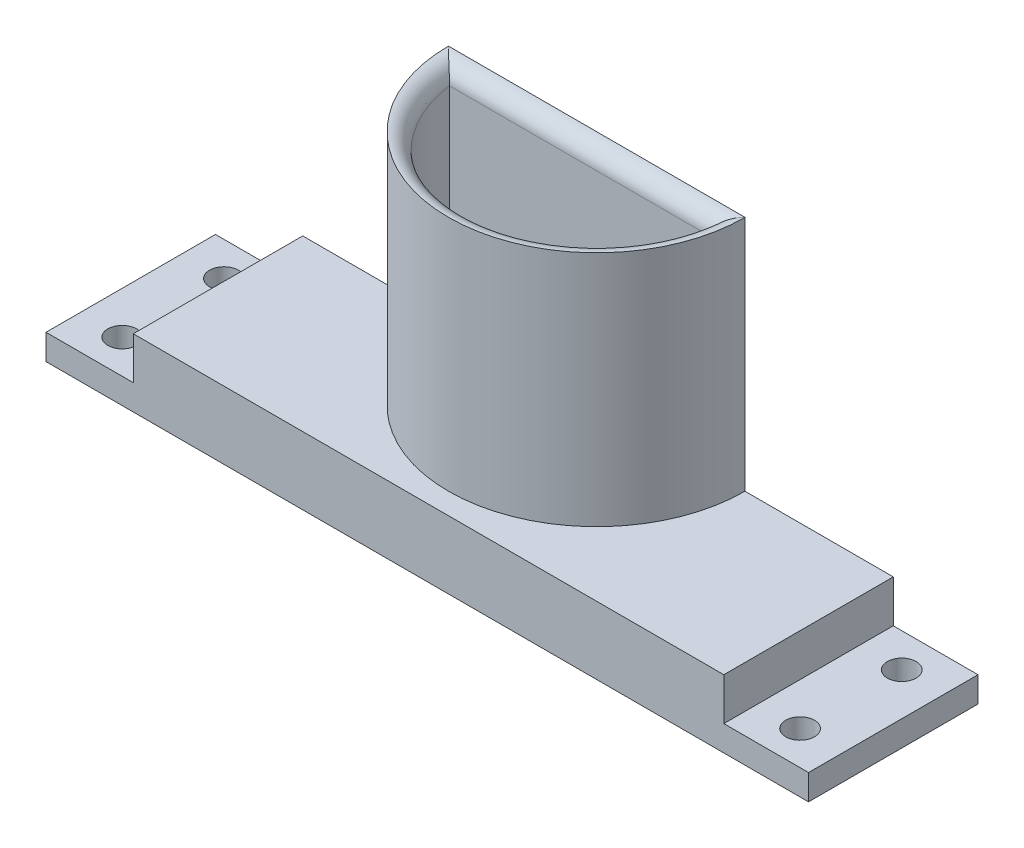
ISO-10303-21;
HEADER;
FILE_DESCRIPTION(('STEP AP214'),'2;1');
FILE_NAME('part.step','',(''),(''),'','','');
FILE_SCHEMA(('AUTOMOTIVE_DESIGN { 1 0 10303 214 1 1 1 1 }'));
ENDSEC;
DATA;
#1=APPLICATION_CONTEXT('core data for automotive mechanical design processes');
#2=APPLICATION_PROTOCOL_DEFINITION('international standard','automotive_design',2000,#1);
#3=PRODUCT_CONTEXT('',#1,'mechanical');
#4=PRODUCT('Part','Part','',(#3));
#5=PRODUCT_RELATED_PRODUCT_CATEGORY('part','',(#4));
#6=PRODUCT_DEFINITION_FORMATION('','',#4);
#7=PRODUCT_DEFINITION_CONTEXT('part definition',#1,'design');
#8=PRODUCT_DEFINITION('design','',#6,#7);
#9=PRODUCT_DEFINITION_SHAPE('','',#8);
#10=(LENGTH_UNIT() NAMED_UNIT(*) SI_UNIT(.MILLI.,.METRE.));
#11=(NAMED_UNIT(*) PLANE_ANGLE_UNIT() SI_UNIT($,.RADIAN.));
#12=(NAMED_UNIT(*) SI_UNIT($,.STERADIAN.) SOLID_ANGLE_UNIT());
#13=UNCERTAINTY_MEASURE_WITH_UNIT(LENGTH_MEASURE(1.E-05),#10,'distance_accuracy_value','');
#14=(GEOMETRIC_REPRESENTATION_CONTEXT(3) GLOBAL_UNCERTAINTY_ASSIGNED_CONTEXT((#13)) GLOBAL_UNIT_ASSIGNED_CONTEXT((#10,
#11,#12)) REPRESENTATION_CONTEXT('',''));
#15=CARTESIAN_POINT('',(0.,0.,0.));
#16=DIRECTION('',(0.,0.,1.));
#17=DIRECTION('',(1.,0.,0.));
#18=AXIS2_PLACEMENT_3D('',#15,#16,#17);
#19=CARTESIAN_POINT('',(0.,5.,0.));
#20=DIRECTION('',(0.,-1.,0.));
#21=DIRECTION('',(0.,0.,-1.));
#22=AXIS2_PLACEMENT_3D('',#19,#20,#21);
#23=PLANE('',#22);
#24=DIRECTION('',(0.,0.,-1.));
#25=VECTOR('',#24,1.);
#26=CARTESIAN_POINT('',(-34.7,5.,10.));
#27=LINE('',#26,#25);
#28=CARTESIAN_POINT('',(-34.7,5.,10.));
#29=VERTEX_POINT('',#28);
#30=CARTESIAN_POINT('',(-34.7,5.,-10.));
#31=VERTEX_POINT('',#30);
#32=EDGE_CURVE('E167',#29,#31,#27,.T.);
#33=ORIENTED_EDGE('',*,*,#32,.F.);
#34=DIRECTION('',(1.,0.,0.));
#35=VECTOR('',#34,1.);
#36=CARTESIAN_POINT('',(-35.,5.,10.));
#37=LINE('',#36,#35);
#38=CARTESIAN_POINT('',(35.,5.,10.));
#39=VERTEX_POINT('',#38);
#40=EDGE_CURVE('E245',#29,#39,#37,.T.);
#41=ORIENTED_EDGE('',*,*,#40,.T.);
#42=DIRECTION('',(0.,0.,-1.));
#43=VECTOR('',#42,1.);
#44=CARTESIAN_POINT('',(35.,5.,10.));
#45=LINE('',#44,#43);
#46=CARTESIAN_POINT('',(35.,5.,-10.));
#47=VERTEX_POINT('',#46);
#48=EDGE_CURVE('E239',#39,#47,#45,.T.);
#49=ORIENTED_EDGE('',*,*,#48,.T.);
#50=DIRECTION('',(-1.,0.,0.));
#51=VECTOR('',#50,1.);
#52=CARTESIAN_POINT('',(-35.,5.,-10.));
#53=LINE('',#52,#51);
#54=CARTESIAN_POINT('',(17.5,5.,-10.));
#55=VERTEX_POINT('',#54);
#56=EDGE_CURVE('E243',#47,#55,#53,.T.);
#57=ORIENTED_EDGE('',*,*,#56,.T.);
#58=CARTESIAN_POINT('',(0.,5.,-10.));
#59=DIRECTION('',(0.,1.,0.));
#60=DIRECTION('',(0.,0.,1.));
#61=AXIS2_PLACEMENT_3D('',#58,#59,#60);
#62=CIRCLE('',#61,17.5);
#63=CARTESIAN_POINT('',(-17.5,5.,-10.));
#64=VERTEX_POINT('',#63);
#65=EDGE_CURVE('E191',#64,#55,#62,.T.);
#66=ORIENTED_EDGE('',*,*,#65,.F.);
#67=EDGE_CURVE('E242',#64,#31,#53,.T.);
#68=ORIENTED_EDGE('',*,*,#67,.T.);
#69=EDGE_LOOP('',(#33,#41,#49,#57,#66,#68));
#70=FACE_BOUND('',#69,.T.);
#71=ADVANCED_FACE('F43',(#70),#23,.F.);
#72=CARTESIAN_POINT('',(35.,5.,10.));
#73=DIRECTION('',(-1.,0.,0.));
#74=DIRECTION('',(0.,0.,1.));
#75=AXIS2_PLACEMENT_3D('',#72,#73,#74);
#76=PLANE('',#75);
#77=DIRECTION('',(0.,0.,-1.));
#78=VECTOR('',#77,1.);
#79=CARTESIAN_POINT('',(35.,0.,10.));
#80=LINE('',#79,#78);
#81=CARTESIAN_POINT('',(35.,0.,10.));
#82=VERTEX_POINT('',#81);
#83=CARTESIAN_POINT('',(35.,0.,-10.));
#84=VERTEX_POINT('',#83);
#85=EDGE_CURVE('E238',#82,#84,#80,.T.);
#86=ORIENTED_EDGE('',*,*,#85,.T.);
#87=DIRECTION('',(0.,-1.,0.));
#88=VECTOR('',#87,1.);
#89=CARTESIAN_POINT('',(35.,5.,-10.));
#90=LINE('',#89,#88);
#91=EDGE_CURVE('E252',#47,#84,#90,.T.);
#92=ORIENTED_EDGE('',*,*,#91,.F.);
#93=ORIENTED_EDGE('',*,*,#48,.F.);
#94=DIRECTION('',(0.,-1.,0.));
#95=VECTOR('',#94,1.);
#96=CARTESIAN_POINT('',(35.,5.,10.));
#97=LINE('',#96,#95);
#98=EDGE_CURVE('E247',#39,#82,#97,.T.);
#99=ORIENTED_EDGE('',*,*,#98,.T.);
#100=EDGE_LOOP('',(#86,#92,#93,#99));
#101=FACE_BOUND('',#100,.T.);
#102=ADVANCED_FACE('F325',(#101),#76,.F.);
#103=CARTESIAN_POINT('',(-35.,5.,-10.));
#104=DIRECTION('',(0.,0.,1.));
#105=DIRECTION('',(1.,0.,0.));
#106=AXIS2_PLACEMENT_3D('',#103,#104,#105);
#107=PLANE('',#106);
#108=DIRECTION('',(1.,0.,0.));
#109=VECTOR('',#108,1.);
#110=CARTESIAN_POINT('',(-45.,0.,-10.));
#111=LINE('',#110,#109);
#112=CARTESIAN_POINT('',(-45.,0.,-10.));
#113=VERTEX_POINT('',#112);
#114=CARTESIAN_POINT('',(-34.7,0.,-10.));
#115=VERTEX_POINT('',#114);
#116=EDGE_CURVE('E142',#113,#115,#111,.T.);
#117=ORIENTED_EDGE('',*,*,#116,.T.);
#118=DIRECTION('',(0.,-1.,0.));
#119=VECTOR('',#118,1.);
#120=CARTESIAN_POINT('',(-34.7,5.,-10.));
#121=LINE('',#120,#119);
#122=EDGE_CURVE('E147',#31,#115,#121,.T.);
#123=ORIENTED_EDGE('',*,*,#122,.F.);
#124=ORIENTED_EDGE('',*,*,#67,.F.);
#125=DIRECTION('',(0.,-1.,0.));
#126=VECTOR('',#125,1.);
#127=CARTESIAN_POINT('',(-17.5,33.,-10.));
#128=LINE('',#127,#126);
#129=CARTESIAN_POINT('',(-17.5,33.,-10.));
#130=VERTEX_POINT('',#129);
#131=EDGE_CURVE('E206',#130,#64,#128,.T.);
#132=ORIENTED_EDGE('',*,*,#131,.F.);
#133=DIRECTION('',(-1.,0.,0.));
#134=VECTOR('',#133,1.);
#135=CARTESIAN_POINT('',(0.,33.,-10.));
#136=LINE('',#135,#134);
#137=CARTESIAN_POINT('',(17.5,33.,-10.));
#138=VERTEX_POINT('',#137);
#139=EDGE_CURVE('E195',#138,#130,#136,.T.);
#140=ORIENTED_EDGE('',*,*,#139,.F.);
#141=DIRECTION('',(0.,-1.,0.));
#142=VECTOR('',#141,1.);
#143=CARTESIAN_POINT('',(17.5,33.,-10.));
#144=LINE('',#143,#142);
#145=EDGE_CURVE('E201',#138,#55,#144,.T.);
#146=ORIENTED_EDGE('',*,*,#145,.T.);
#147=ORIENTED_EDGE('',*,*,#56,.F.);
#148=ORIENTED_EDGE('',*,*,#91,.T.);
#149=CARTESIAN_POINT('',(45.,0.,-10.));
#150=VERTEX_POINT('',#149);
#151=EDGE_CURVE('E155',#84,#150,#111,.T.);
#152=ORIENTED_EDGE('',*,*,#151,.T.);
#153=DIRECTION('',(0.,1.,0.));
#154=VECTOR('',#153,1.);
#155=CARTESIAN_POINT('',(45.,-3.,-10.));
#156=LINE('',#155,#154);
#157=CARTESIAN_POINT('',(45.,-3.,-10.));
#158=VERTEX_POINT('',#157);
#159=EDGE_CURVE('E220',#158,#150,#156,.T.);
#160=ORIENTED_EDGE('',*,*,#159,.F.);
#161=DIRECTION('',(1.,0.,0.));
#162=VECTOR('',#161,1.);
#163=CARTESIAN_POINT('',(-45.,-3.,-10.));
#164=LINE('',#163,#162);
#165=CARTESIAN_POINT('',(17.5,-3.,-10.));
#166=VERTEX_POINT('',#165);
#167=EDGE_CURVE('E216',#166,#158,#164,.T.);
#168=ORIENTED_EDGE('',*,*,#167,.F.);
#169=CARTESIAN_POINT('',(-17.5,-3.,-10.));
#170=VERTEX_POINT('',#169);
#171=EDGE_CURVE('E221',#170,#166,#164,.T.);
#172=ORIENTED_EDGE('',*,*,#171,.F.);
#173=CARTESIAN_POINT('',(-45.,-3.,-10.));
#174=VERTEX_POINT('',#173);
#175=EDGE_CURVE('E217',#174,#170,#164,.T.);
#176=ORIENTED_EDGE('',*,*,#175,.F.);
#177=DIRECTION('',(0.,1.,0.));
#178=VECTOR('',#177,1.);
#179=CARTESIAN_POINT('',(-45.,-3.,-10.));
#180=LINE('',#179,#178);
#181=EDGE_CURVE('E151',#174,#113,#180,.T.);
#182=ORIENTED_EDGE('',*,*,#181,.T.);
#183=EDGE_LOOP('',(#117,#123,#124,#132,#140,#146,#147,#148,#152,#160,#168,#172,#176,#182));
#184=FACE_BOUND('',#183,.T.);
#185=ADVANCED_FACE('F144',(#184),#107,.F.);
#186=CARTESIAN_POINT('',(-35.,5.,10.));
#187=DIRECTION('',(0.,0.,-1.));
#188=DIRECTION('',(-1.,0.,0.));
#189=AXIS2_PLACEMENT_3D('',#186,#187,#188);
#190=PLANE('',#189);
#191=DIRECTION('',(0.,1.,0.));
#192=VECTOR('',#191,1.);
#193=CARTESIAN_POINT('',(-34.7,0.,10.));
#194=LINE('',#193,#192);
#195=CARTESIAN_POINT('',(-34.7,0.,10.));
#196=VERTEX_POINT('',#195);
#197=EDGE_CURVE('E163',#196,#29,#194,.T.);
#198=ORIENTED_EDGE('',*,*,#197,.F.);
#199=DIRECTION('',(-1.,0.,0.));
#200=VECTOR('',#199,1.);
#201=CARTESIAN_POINT('',(-45.,0.,10.));
#202=LINE('',#201,#200);
#203=CARTESIAN_POINT('',(-45.,0.,10.));
#204=VERTEX_POINT('',#203);
#205=EDGE_CURVE('E160',#196,#204,#202,.T.);
#206=ORIENTED_EDGE('',*,*,#205,.T.);
#207=DIRECTION('',(0.,1.,0.));
#208=VECTOR('',#207,1.);
#209=CARTESIAN_POINT('',(-45.,-3.,10.));
#210=LINE('',#209,#208);
#211=CARTESIAN_POINT('',(-45.,-3.,10.));
#212=VERTEX_POINT('',#211);
#213=EDGE_CURVE('E232',#212,#204,#210,.T.);
#214=ORIENTED_EDGE('',*,*,#213,.F.);
#215=DIRECTION('',(-1.,0.,0.));
#216=VECTOR('',#215,1.);
#217=CARTESIAN_POINT('',(-45.,-3.,10.));
#218=LINE('',#217,#216);
#219=CARTESIAN_POINT('',(45.,-3.,10.));
#220=VERTEX_POINT('',#219);
#221=EDGE_CURVE('E212',#220,#212,#218,.T.);
#222=ORIENTED_EDGE('',*,*,#221,.F.);
#223=DIRECTION('',(0.,1.,0.));
#224=VECTOR('',#223,1.);
#225=CARTESIAN_POINT('',(45.,-3.,10.));
#226=LINE('',#225,#224);
#227=CARTESIAN_POINT('',(45.,0.,10.));
#228=VERTEX_POINT('',#227);
#229=EDGE_CURVE('E235',#220,#228,#226,.T.);
#230=ORIENTED_EDGE('',*,*,#229,.T.);
#231=EDGE_CURVE('E224',#228,#82,#202,.T.);
#232=ORIENTED_EDGE('',*,*,#231,.T.);
#233=ORIENTED_EDGE('',*,*,#98,.F.);
#234=ORIENTED_EDGE('',*,*,#40,.F.);
#235=EDGE_LOOP('',(#198,#206,#214,#222,#230,#232,#233,#234));
#236=FACE_BOUND('',#235,.T.);
#237=ADVANCED_FACE('F338',(#236),#190,.F.);
#238=CARTESIAN_POINT('',(0.,0.,0.));
#239=DIRECTION('',(0.,1.,0.));
#240=DIRECTION('',(0.,0.,1.));
#241=AXIS2_PLACEMENT_3D('',#238,#239,#240);
#242=PLANE('',#241);
#243=CARTESIAN_POINT('',(40.,0.,-6.));
#244=DIRECTION('',(0.,1.,0.));
#245=DIRECTION('',(0.,0.,1.));
#246=AXIS2_PLACEMENT_3D('',#243,#244,#245);
#247=CIRCLE('',#246,1.69999999999999);
#248=CARTESIAN_POINT('',(40.,0.,-4.3));
#249=VERTEX_POINT('',#248);
#250=EDGE_CURVE('E179',#249,#249,#247,.T.);
#251=ORIENTED_EDGE('',*,*,#250,.F.);
#252=EDGE_LOOP('',(#251));
#253=FACE_BOUND('',#252,.T.);
#254=CARTESIAN_POINT('',(40.,0.,6.));
#255=DIRECTION('',(0.,1.,0.));
#256=DIRECTION('',(0.,0.,1.));
#257=AXIS2_PLACEMENT_3D('',#254,#255,#256);
#258=CIRCLE('',#257,1.69999999999999);
#259=CARTESIAN_POINT('',(40.,0.,7.69999999999999));
#260=VERTEX_POINT('',#259);
#261=EDGE_CURVE('E185',#260,#260,#258,.T.);
#262=ORIENTED_EDGE('',*,*,#261,.F.);
#263=EDGE_LOOP('',(#262));
#264=FACE_BOUND('',#263,.T.);
#265=ORIENTED_EDGE('',*,*,#85,.F.);
#266=ORIENTED_EDGE('',*,*,#231,.F.);
#267=DIRECTION('',(0.,0.,1.));
#268=VECTOR('',#267,1.);
#269=CARTESIAN_POINT('',(45.,0.,-10.));
#270=LINE('',#269,#268);
#271=EDGE_CURVE('E209',#150,#228,#270,.T.);
#272=ORIENTED_EDGE('',*,*,#271,.F.);
#273=ORIENTED_EDGE('',*,*,#151,.F.);
#274=EDGE_LOOP('',(#265,#266,#272,#273));
#275=FACE_BOUND('',#274,.T.);
#276=ADVANCED_FACE('F341',(#253,#264,#275),#242,.T.);
#277=CARTESIAN_POINT('',(-40.,0.,-6.));
#278=DIRECTION('',(0.,1.,0.));
#279=DIRECTION('',(0.,0.,1.));
#280=AXIS2_PLACEMENT_3D('',#277,#278,#279);
#281=CIRCLE('',#280,1.69999999999999);
#282=CARTESIAN_POINT('',(-40.,0.,-4.30000000000001));
#283=VERTEX_POINT('',#282);
#284=EDGE_CURVE('E172',#283,#283,#281,.T.);
#285=ORIENTED_EDGE('',*,*,#284,.F.);
#286=EDGE_LOOP('',(#285));
#287=FACE_BOUND('',#286,.T.);
#288=CARTESIAN_POINT('',(-40.,0.,6.));
#289=DIRECTION('',(0.,1.,0.));
#290=DIRECTION('',(0.,0.,1.));
#291=AXIS2_PLACEMENT_3D('',#288,#289,#290);
#292=CIRCLE('',#291,1.69999999999999);
#293=CARTESIAN_POINT('',(-40.,0.,7.69999999999999));
#294=VERTEX_POINT('',#293);
#295=EDGE_CURVE('E175',#294,#294,#292,.T.);
#296=ORIENTED_EDGE('',*,*,#295,.F.);
#297=EDGE_LOOP('',(#296));
#298=FACE_BOUND('',#297,.T.);
#299=ORIENTED_EDGE('',*,*,#205,.F.);
#300=DIRECTION('',(0.,0.,1.));
#301=VECTOR('',#300,1.);
#302=CARTESIAN_POINT('',(-34.7,0.,-10.));
#303=LINE('',#302,#301);
#304=EDGE_CURVE('E158',#115,#196,#303,.T.);
#305=ORIENTED_EDGE('',*,*,#304,.F.);
#306=ORIENTED_EDGE('',*,*,#116,.F.);
#307=DIRECTION('',(0.,0.,-1.));
#308=VECTOR('',#307,1.);
#309=CARTESIAN_POINT('',(-45.,0.,-10.));
#310=LINE('',#309,#308);
#311=EDGE_CURVE('E227',#204,#113,#310,.T.);
#312=ORIENTED_EDGE('',*,*,#311,.F.);
#313=EDGE_LOOP('',(#299,#305,#306,#312));
#314=FACE_BOUND('',#313,.T.);
#315=ADVANCED_FACE('F159',(#287,#298,#314),#242,.T.);
#316=CARTESIAN_POINT('',(45.,-3.,-10.));
#317=DIRECTION('',(-1.,0.,0.));
#318=DIRECTION('',(0.,0.,1.));
#319=AXIS2_PLACEMENT_3D('',#316,#317,#318);
#320=PLANE('',#319);
#321=ORIENTED_EDGE('',*,*,#271,.T.);
#322=ORIENTED_EDGE('',*,*,#229,.F.);
#323=DIRECTION('',(0.,0.,1.));
#324=VECTOR('',#323,1.);
#325=CARTESIAN_POINT('',(45.,-3.,-10.));
#326=LINE('',#325,#324);
#327=EDGE_CURVE('E154',#158,#220,#326,.T.);
#328=ORIENTED_EDGE('',*,*,#327,.F.);
#329=ORIENTED_EDGE('',*,*,#159,.T.);
#330=EDGE_LOOP('',(#321,#322,#328,#329));
#331=FACE_BOUND('',#330,.T.);
#332=ADVANCED_FACE('F336',(#331),#320,.F.);
#333=CARTESIAN_POINT('',(-45.,-3.,-10.));
#334=DIRECTION('',(1.,0.,0.));
#335=DIRECTION('',(0.,0.,-1.));
#336=AXIS2_PLACEMENT_3D('',#333,#334,#335);
#337=PLANE('',#336);
#338=ORIENTED_EDGE('',*,*,#311,.T.);
#339=ORIENTED_EDGE('',*,*,#181,.F.);
#340=DIRECTION('',(0.,0.,-1.));
#341=VECTOR('',#340,1.);
#342=CARTESIAN_POINT('',(-45.,-3.,-10.));
#343=LINE('',#342,#341);
#344=EDGE_CURVE('E214',#212,#174,#343,.T.);
#345=ORIENTED_EDGE('',*,*,#344,.F.);
#346=ORIENTED_EDGE('',*,*,#213,.T.);
#347=EDGE_LOOP('',(#338,#339,#345,#346));
#348=FACE_BOUND('',#347,.T.);
#349=ADVANCED_FACE('F466',(#348),#337,.F.);
#350=CARTESIAN_POINT('',(0.,-3.,0.));
#351=DIRECTION('',(0.,1.,0.));
#352=DIRECTION('',(0.,0.,1.));
#353=AXIS2_PLACEMENT_3D('',#350,#351,#352);
#354=PLANE('',#353);
#355=CARTESIAN_POINT('',(-40.,-3.,-6.));
#356=DIRECTION('',(0.,1.,0.));
#357=DIRECTION('',(0.,0.,1.));
#358=AXIS2_PLACEMENT_3D('',#355,#356,#357);
#359=CIRCLE('',#358,1.69999999999999);
#360=CARTESIAN_POINT('',(-40.,-3.,-4.30000000000001));
#361=VERTEX_POINT('',#360);
#362=EDGE_CURVE('E48',#361,#361,#359,.T.);
#363=ORIENTED_EDGE('',*,*,#362,.T.);
#364=EDGE_LOOP('',(#363));
#365=FACE_BOUND('',#364,.T.);
#366=CARTESIAN_POINT('',(-40.,-3.,6.));
#367=DIRECTION('',(0.,1.,0.));
#368=DIRECTION('',(0.,0.,1.));
#369=AXIS2_PLACEMENT_3D('',#366,#367,#368);
#370=CIRCLE('',#369,1.69999999999999);
#371=CARTESIAN_POINT('',(-40.,-3.,7.69999999999999));
#372=VERTEX_POINT('',#371);
#373=EDGE_CURVE('E178',#372,#372,#370,.T.);
#374=ORIENTED_EDGE('',*,*,#373,.T.);
#375=EDGE_LOOP('',(#374));
#376=FACE_BOUND('',#375,.T.);
#377=CARTESIAN_POINT('',(40.,-3.,-6.));
#378=DIRECTION('',(0.,1.,0.));
#379=DIRECTION('',(0.,0.,1.));
#380=AXIS2_PLACEMENT_3D('',#377,#378,#379);
#381=CIRCLE('',#380,1.69999999999999);
#382=CARTESIAN_POINT('',(40.,-3.,-4.30000000000001));
#383=VERTEX_POINT('',#382);
#384=EDGE_CURVE('E182',#383,#383,#381,.T.);
#385=ORIENTED_EDGE('',*,*,#384,.T.);
#386=EDGE_LOOP('',(#385));
#387=FACE_BOUND('',#386,.T.);
#388=CARTESIAN_POINT('',(40.,-3.,6.));
#389=DIRECTION('',(0.,1.,0.));
#390=DIRECTION('',(0.,0.,1.));
#391=AXIS2_PLACEMENT_3D('',#388,#389,#390);
#392=CIRCLE('',#391,1.69999999999999);
#393=CARTESIAN_POINT('',(40.,-3.,7.69999999999999));
#394=VERTEX_POINT('',#393);
#395=EDGE_CURVE('E188',#394,#394,#392,.T.);
#396=ORIENTED_EDGE('',*,*,#395,.T.);
#397=EDGE_LOOP('',(#396));
#398=FACE_BOUND('',#397,.T.);
#399=ORIENTED_EDGE('',*,*,#175,.T.);
#400=CARTESIAN_POINT('',(0.,-3.,-10.));
#401=DIRECTION('',(0.,1.,0.));
#402=DIRECTION('',(0.,0.,1.));
#403=AXIS2_PLACEMENT_3D('',#400,#401,#402);
#404=CIRCLE('',#403,17.5);
#405=EDGE_CURVE('E261',#170,#166,#404,.T.);
#406=ORIENTED_EDGE('',*,*,#405,.T.);
#407=ORIENTED_EDGE('',*,*,#167,.T.);
#408=ORIENTED_EDGE('',*,*,#327,.T.);
#409=ORIENTED_EDGE('',*,*,#221,.T.);
#410=ORIENTED_EDGE('',*,*,#344,.T.);
#411=EDGE_LOOP('',(#399,#406,#407,#408,#409,#410));
#412=FACE_BOUND('',#411,.T.);
#413=ADVANCED_FACE('F306',(#365,#376,#387,#398,#412),#354,.F.);
#414=CARTESIAN_POINT('',(0.,33.,-10.));
#415=DIRECTION('',(0.,-1.,0.));
#416=DIRECTION('',(0.,0.,-1.));
#417=AXIS2_PLACEMENT_3D('',#414,#415,#416);
#418=CYLINDRICAL_SURFACE('',#417,17.5);
#419=ORIENTED_EDGE('',*,*,#65,.T.);
#420=ORIENTED_EDGE('',*,*,#145,.F.);
#421=CARTESIAN_POINT('',(0.,33.,-10.));
#422=DIRECTION('',(0.,1.,0.));
#423=DIRECTION('',(0.,0.,1.));
#424=AXIS2_PLACEMENT_3D('',#421,#422,#423);
#425=CIRCLE('',#424,17.5);
#426=EDGE_CURVE('E198',#130,#138,#425,.T.);
#427=ORIENTED_EDGE('',*,*,#426,.F.);
#428=ORIENTED_EDGE('',*,*,#131,.T.);
#429=EDGE_LOOP('',(#419,#420,#427,#428));
#430=FACE_BOUND('',#429,.T.);
#431=ADVANCED_FACE('F449',(#430),#418,.T.);
#432=CARTESIAN_POINT('',(0.,-3.,-10.));
#433=DIRECTION('',(0.,1.,0.));
#434=DIRECTION('',(0.,0.,1.));
#435=AXIS2_PLACEMENT_3D('',#432,#433,#434);
#436=CYLINDRICAL_SURFACE('',#435,15.5);
#437=DIRECTION('',(0.,1.,0.));
#438=VECTOR('',#437,1.);
#439=CARTESIAN_POINT('',(15.3704261489394,-3.,-8.));
#440=LINE('',#439,#438);
#441=CARTESIAN_POINT('',(15.3704261489394,-1.,-8.));
#442=VERTEX_POINT('',#441);
#443=CARTESIAN_POINT('',(15.3704261489394,31.,-8.));
#444=VERTEX_POINT('',#443);
#445=EDGE_CURVE('E192',#442,#444,#440,.T.);
#446=ORIENTED_EDGE('',*,*,#445,.F.);
#447=CARTESIAN_POINT('',(0.,-1.,-10.));
#448=DIRECTION('',(0.,1.,0.));
#449=DIRECTION('',(0.,0.,1.));
#450=AXIS2_PLACEMENT_3D('',#447,#448,#449);
#451=CIRCLE('',#450,15.5);
#452=CARTESIAN_POINT('',(-15.3704261489394,-1.,-8.));
#453=VERTEX_POINT('',#452);
#454=EDGE_CURVE('E11',#442,#453,#451,.F.);
#455=ORIENTED_EDGE('',*,*,#454,.T.);
#456=DIRECTION('',(0.,1.,0.));
#457=VECTOR('',#456,1.);
#458=CARTESIAN_POINT('',(-15.3704261489394,-3.,-8.));
#459=LINE('',#458,#457);
#460=CARTESIAN_POINT('',(-15.3704261489394,31.,-8.));
#461=VERTEX_POINT('',#460);
#462=EDGE_CURVE('E189',#453,#461,#459,.T.);
#463=ORIENTED_EDGE('',*,*,#462,.T.);
#464=CARTESIAN_POINT('',(0.,31.,-10.));
#465=DIRECTION('',(0.,1.,0.));
#466=DIRECTION('',(0.,0.,1.));
#467=AXIS2_PLACEMENT_3D('',#464,#465,#466);
#468=CIRCLE('',#467,15.5);
#469=EDGE_CURVE('E255',#461,#444,#468,.T.);
#470=ORIENTED_EDGE('',*,*,#469,.T.);
#471=EDGE_LOOP('',(#446,#455,#463,#470));
#472=FACE_BOUND('',#471,.T.);
#473=ADVANCED_FACE('F440',(#472),#436,.F.);
#474=CARTESIAN_POINT('',(15.3704261489394,-3.,-8.));
#475=DIRECTION('',(0.,0.,-1.));
#476=DIRECTION('',(-1.,0.,0.));
#477=AXIS2_PLACEMENT_3D('',#474,#475,#476);
#478=PLANE('',#477);
#479=ORIENTED_EDGE('',*,*,#462,.F.);
#480=DIRECTION('',(-1.,0.,0.));
#481=VECTOR('',#480,1.);
#482=CARTESIAN_POINT('',(15.3704261489394,-1.,-8.));
#483=LINE('',#482,#481);
#484=EDGE_CURVE('E53',#453,#442,#483,.F.);
#485=ORIENTED_EDGE('',*,*,#484,.T.);
#486=ORIENTED_EDGE('',*,*,#445,.T.);
#487=DIRECTION('',(-1.,0.,0.));
#488=VECTOR('',#487,1.);
#489=CARTESIAN_POINT('',(-15.3704261489394,31.,-8.));
#490=LINE('',#489,#488);
#491=EDGE_CURVE('E258',#444,#461,#490,.T.);
#492=ORIENTED_EDGE('',*,*,#491,.T.);
#493=EDGE_LOOP('',(#479,#485,#486,#492));
#494=FACE_BOUND('',#493,.T.);
#495=ADVANCED_FACE('F282',(#494),#478,.F.);
#496=CARTESIAN_POINT('',(15.3704261489394,31.,-10.));
#497=DIRECTION('',(1.,0.,0.));
#498=DIRECTION('',(0.,0.,-1.));
#499=AXIS2_PLACEMENT_3D('',#496,#497,#498);
#500=CYLINDRICAL_SURFACE('',#499,2.);
#501=CARTESIAN_POINT('',(15.3704261489394,31.,-8.));
#502=CARTESIAN_POINT('',(15.3704113490324,31.0434603124713,-7.99998789623637));
#503=CARTESIAN_POINT('',(15.3720384867977,31.0869097163397,-8.00141614860178));
#504=CARTESIAN_POINT('',(15.3784623074006,31.1733474667974,-8.00705955264037));
#505=CARTESIAN_POINT('',(15.3832557060606,31.2163362442655,-8.01127181662339));
#506=CARTESIAN_POINT('',(15.3958332317555,31.3010678103459,-8.0223326945883));
#507=CARTESIAN_POINT('',(15.4035861385886,31.3428188610949,-8.02915378911016));
#508=CARTESIAN_POINT('',(15.4218873065089,31.4252097834838,-8.04527211246546));
#509=CARTESIAN_POINT('',(15.4324361262038,31.4658494312796,-8.05456983611728));
#510=CARTESIAN_POINT('',(15.4678452451839,31.5853710437738,-8.08581947718849));
#511=CARTESIAN_POINT('',(15.496533325425,31.6622711603222,-8.11118487201765));
#512=CARTESIAN_POINT('',(15.5621676042231,31.8095168129804,-8.16942803416061));
#513=CARTESIAN_POINT('',(15.5991370150493,31.8798431219544,-8.20232692346899));
#514=CARTESIAN_POINT('',(15.6990783145784,32.0460657957153,-8.29164333111114));
#515=CARTESIAN_POINT('',(15.7659303858716,32.137671288152,-8.35169901986379));
#516=CARTESIAN_POINT('',(15.9090438640022,32.3055985847829,-8.48121517508006));
#517=CARTESIAN_POINT('',(15.9853250889464,32.3818872824975,-8.55069548098992));
#518=CARTESIAN_POINT('',(16.1218211511116,32.5007425086086,-8.67599534594904));
#519=CARTESIAN_POINT('',(16.1805623666144,32.5467729873894,-8.7302004625344));
#520=CARTESIAN_POINT('',(16.3004423371165,32.6317687906735,-8.84145191677523));
#521=CARTESIAN_POINT('',(16.3615821779766,32.6707308693488,-8.89849954447002));
#522=CARTESIAN_POINT('',(16.5476428293294,32.7775070718227,-9.07311939366307));
#523=CARTESIAN_POINT('',(16.6752124326251,32.8352175913138,-9.19417559964872));
#524=CARTESIAN_POINT('',(16.9181145433245,32.9198098930191,-9.42741593743311));
#525=CARTESIAN_POINT('',(17.0331179892186,32.9495227784052,-9.53896495980482));
#526=CARTESIAN_POINT('',(17.2635313505971,32.9894097494525,-9.76475155047689));
#527=CARTESIAN_POINT('',(17.3789397753517,32.9996275202113,-9.87898252567176));
#528=CARTESIAN_POINT('',(17.495783478261,32.9999966634796,-9.99578385666528));
#529=CARTESIAN_POINT('',(17.4978918559567,32.9999999965333,-9.99789185333453));
#530=CARTESIAN_POINT('',(17.5,33.,-10.));
#531=B_SPLINE_CURVE_WITH_KNOTS('',3,(#501,#502,#503,#504,#505,#506,#507,#508,#509,#510,#511,
#512,#513,#514,#515,#516,#517,#518,#519,#520,#521,#522,#523,#524,#525,#526,#527,#528,#529,#530),
.UNSPECIFIED.,.F.,.F.,(4,2,2,2,2,2,2,2,2,2,2,2,2,2,4),(0.,0.130309398659017,0.260483846779937,
0.389321409732268,0.518184733132639,0.774655769336656,1.03185488546772,1.41469409605983,
1.7983520909447,2.07470453961497,2.35118357061114,2.90410540558524,3.39188285813809,
3.87856599820887,3.88751027574357),.UNSPECIFIED.);
#532=EDGE_CURVE('E262',#138,#444,#531,.F.);
#533=ORIENTED_EDGE('',*,*,#532,.F.);
#534=ORIENTED_EDGE('',*,*,#139,.T.);
#535=CARTESIAN_POINT('',(-15.3704261489394,31.,-8.));
#536=CARTESIAN_POINT('',(-15.3704113490324,31.0434603124713,-7.99998789623637));
#537=CARTESIAN_POINT('',(-15.3720384867977,31.0869097163397,-8.00141614860178));
#538=CARTESIAN_POINT('',(-15.3784623074006,31.1733474667974,-8.00705955264037));
#539=CARTESIAN_POINT('',(-15.3832557060606,31.2163362442655,-8.01127181662339));
#540=CARTESIAN_POINT('',(-15.3958332317555,31.3010678103459,-8.0223326945883));
#541=CARTESIAN_POINT('',(-15.4035861385886,31.3428188610949,-8.02915378911016));
#542=CARTESIAN_POINT('',(-15.4218873065089,31.4252097834838,-8.04527211246546));
#543=CARTESIAN_POINT('',(-15.4324361262038,31.4658494312796,-8.05456983611728));
#544=CARTESIAN_POINT('',(-15.4678452451839,31.5853710437738,-8.08581947718849));
#545=CARTESIAN_POINT('',(-15.496533325425,31.6622711603222,-8.11118487201765));
#546=CARTESIAN_POINT('',(-15.5621676042231,31.8095168129804,-8.16942803416061));
#547=CARTESIAN_POINT('',(-15.5991370150493,31.8798431219544,-8.20232692346899));
#548=CARTESIAN_POINT('',(-15.6990783145784,32.0460657957153,-8.29164333111114));
#549=CARTESIAN_POINT('',(-15.7659303858716,32.137671288152,-8.35169901986379));
#550=CARTESIAN_POINT('',(-15.9090438640022,32.3055985847829,-8.48121517508006));
#551=CARTESIAN_POINT('',(-15.9853250889464,32.3818872824975,-8.55069548098992));
#552=CARTESIAN_POINT('',(-16.1218211511116,32.5007425086086,-8.67599534594904));
#553=CARTESIAN_POINT('',(-16.1805623666144,32.5467729873894,-8.7302004625344));
#554=CARTESIAN_POINT('',(-16.3004423371165,32.6317687906735,-8.84145191677523));
#555=CARTESIAN_POINT('',(-16.3615821779766,32.6707308693488,-8.89849954447002));
#556=CARTESIAN_POINT('',(-16.5476428293294,32.7775070718227,-9.07311939366307));
#557=CARTESIAN_POINT('',(-16.6752124326251,32.8352175913138,-9.19417559964872));
#558=CARTESIAN_POINT('',(-16.9181145433245,32.9198098930191,-9.42741593743311));
#559=CARTESIAN_POINT('',(-17.0331179892186,32.9495227784052,-9.53896495980482));
#560=CARTESIAN_POINT('',(-17.2635313505971,32.9894097494525,-9.76475155047689));
#561=CARTESIAN_POINT('',(-17.3789397753517,32.9996275202113,-9.87898252567176));
#562=CARTESIAN_POINT('',(-17.495783478261,32.9999966634796,-9.99578385666528));
#563=CARTESIAN_POINT('',(-17.4978918559567,32.9999999965333,-9.99789185333453));
#564=CARTESIAN_POINT('',(-17.5,33.,-10.));
#565=B_SPLINE_CURVE_WITH_KNOTS('',3,(#535,#536,#537,#538,#539,#540,#541,#542,#543,#544,#545,
#546,#547,#548,#549,#550,#551,#552,#553,#554,#555,#556,#557,#558,#559,#560,#561,#562,#563,#564),
.UNSPECIFIED.,.F.,.F.,(4,2,2,2,2,2,2,2,2,2,2,2,2,2,4),(0.,0.130309398659017,0.260483846779937,
0.389321409732268,0.518184733132639,0.774655769336656,1.03185488546772,1.41469409605983,
1.7983520909447,2.07470453961497,2.35118357061114,2.90410540558524,3.39188285813809,
3.87856599820887,3.88751027574357),.UNSPECIFIED.);
#566=EDGE_CURVE('E194',#461,#130,#565,.T.);
#567=ORIENTED_EDGE('',*,*,#566,.F.);
#568=ORIENTED_EDGE('',*,*,#491,.F.);
#569=EDGE_LOOP('',(#533,#534,#567,#568));
#570=FACE_BOUND('',#569,.T.);
#571=ADVANCED_FACE('F279',(#570),#500,.T.);
#572=CARTESIAN_POINT('',(0.,31.,-10.));
#573=DIRECTION('',(0.,1.,0.));
#574=DIRECTION('',(0.,0.,1.));
#575=AXIS2_PLACEMENT_3D('',#572,#573,#574);
#576=TOROIDAL_SURFACE('',#575,17.5,2.);
#577=ORIENTED_EDGE('',*,*,#566,.T.);
#578=ORIENTED_EDGE('',*,*,#426,.T.);
#579=ORIENTED_EDGE('',*,*,#532,.T.);
#580=ORIENTED_EDGE('',*,*,#469,.F.);
#581=EDGE_LOOP('',(#577,#578,#579,#580));
#582=FACE_BOUND('',#581,.T.);
#583=ADVANCED_FACE('F276',(#582),#576,.T.);
#584=CARTESIAN_POINT('',(0.,-1.,-10.));
#585=DIRECTION('',(0.,1.,0.));
#586=DIRECTION('',(0.,0.,1.));
#587=AXIS2_PLACEMENT_3D('',#584,#585,#586);
#588=TOROIDAL_SURFACE('',#587,17.5,2.);
#589=CARTESIAN_POINT('',(-15.3704261489394,-1.,-8.));
#590=CARTESIAN_POINT('',(-15.3704113490324,-1.04346031247127,-7.99998789623637));
#591=CARTESIAN_POINT('',(-15.3720384867977,-1.0869097163397,-8.00141614860178));
#592=CARTESIAN_POINT('',(-15.3784623074006,-1.17334746679736,-8.00705955264037));
#593=CARTESIAN_POINT('',(-15.3832557060606,-1.21633624426547,-8.01127181662339));
#594=CARTESIAN_POINT('',(-15.3958332317555,-1.30106781034593,-8.0223326945883));
#595=CARTESIAN_POINT('',(-15.4035861385886,-1.34281886109492,-8.02915378911016));
#596=CARTESIAN_POINT('',(-15.4218873065089,-1.42520978348377,-8.04527211246546));
#597=CARTESIAN_POINT('',(-15.4324361262038,-1.46584943127963,-8.05456983611728));
#598=CARTESIAN_POINT('',(-15.4678452451839,-1.58537104377379,-8.08581947718849));
#599=CARTESIAN_POINT('',(-15.496533325425,-1.66227116032219,-8.11118487201765));
#600=CARTESIAN_POINT('',(-15.5621676042231,-1.80951681298037,-8.16942803416061));
#601=CARTESIAN_POINT('',(-15.5991370150493,-1.87984312195444,-8.20232692346899));
#602=CARTESIAN_POINT('',(-15.6990783145784,-2.04606579571527,-8.29164333111114));
#603=CARTESIAN_POINT('',(-15.7659303858716,-2.13767128815196,-8.35169901986379));
#604=CARTESIAN_POINT('',(-15.9090438640022,-2.30559858478294,-8.48121517508007));
#605=CARTESIAN_POINT('',(-15.9853250889464,-2.38188728249755,-8.55069548098992));
#606=CARTESIAN_POINT('',(-16.1218211511116,-2.50074250860862,-8.67599534594904));
#607=CARTESIAN_POINT('',(-16.1805623666144,-2.54677298738937,-8.73020046253439));
#608=CARTESIAN_POINT('',(-16.3004423371165,-2.63176879067351,-8.84145191677522));
#609=CARTESIAN_POINT('',(-16.3615821779766,-2.67073086934884,-8.89849954447002));
#610=CARTESIAN_POINT('',(-16.5476428293294,-2.77750707182268,-9.07311939366307));
#611=CARTESIAN_POINT('',(-16.6752124326252,-2.83521759131378,-9.19417559964869));
#612=CARTESIAN_POINT('',(-16.9181145433245,-2.9198098930191,-9.42741593743313));
#613=CARTESIAN_POINT('',(-17.0331179892185,-2.94952277840521,-9.5389649598049));
#614=CARTESIAN_POINT('',(-17.2635313505972,-2.98940974945247,-9.76475155047682));
#615=CARTESIAN_POINT('',(-17.378939775352,-2.99962752021137,-9.87898252567148));
#616=CARTESIAN_POINT('',(-17.495783478261,-2.99999666347959,-9.99578385666527));
#617=CARTESIAN_POINT('',(-17.4978918559567,-2.99999999653327,-9.99789185333453));
#618=CARTESIAN_POINT('',(-17.5,-3.,-10.));
#619=B_SPLINE_CURVE_WITH_KNOTS('',3,(#589,#590,#591,#592,#593,#594,#595,#596,#597,#598,#599,
#600,#601,#602,#603,#604,#605,#606,#607,#608,#609,#610,#611,#612,#613,#614,#615,#616,#617,#618),
.UNSPECIFIED.,.F.,.F.,(4,2,2,2,2,2,2,2,2,2,2,2,2,2,4),(0.,0.130309398659014,0.260483846779928,
0.389321409732269,0.518184733132643,0.77465576933666,1.03185488546773,1.41469409605983,
1.7983520909447,2.07470453961497,2.35118357061113,2.90410540558525,3.39188285813811,
3.87856599820888,3.88751027574357),.UNSPECIFIED.);
#620=EDGE_CURVE('E291',#453,#170,#619,.T.);
#621=ORIENTED_EDGE('',*,*,#620,.F.);
#622=ORIENTED_EDGE('',*,*,#454,.F.);
#623=CARTESIAN_POINT('',(15.3704261489394,-1.,-8.));
#624=CARTESIAN_POINT('',(15.3704113490324,-1.04346031247127,-7.99998789623637));
#625=CARTESIAN_POINT('',(15.3720384867977,-1.0869097163397,-8.00141614860178));
#626=CARTESIAN_POINT('',(15.3784623074006,-1.17334746679736,-8.00705955264037));
#627=CARTESIAN_POINT('',(15.3832557060606,-1.21633624426547,-8.01127181662339));
#628=CARTESIAN_POINT('',(15.3958332317555,-1.30106781034593,-8.0223326945883));
#629=CARTESIAN_POINT('',(15.4035861385886,-1.34281886109492,-8.02915378911016));
#630=CARTESIAN_POINT('',(15.4218873065089,-1.42520978348377,-8.04527211246546));
#631=CARTESIAN_POINT('',(15.4324361262038,-1.46584943127963,-8.05456983611728));
#632=CARTESIAN_POINT('',(15.4678452451839,-1.58537104377379,-8.08581947718849));
#633=CARTESIAN_POINT('',(15.496533325425,-1.66227116032219,-8.11118487201765));
#634=CARTESIAN_POINT('',(15.5621676042231,-1.80951681298037,-8.16942803416061));
#635=CARTESIAN_POINT('',(15.5991370150493,-1.87984312195444,-8.20232692346899));
#636=CARTESIAN_POINT('',(15.6990783145784,-2.04606579571527,-8.29164333111114));
#637=CARTESIAN_POINT('',(15.7659303858716,-2.13767128815196,-8.35169901986379));
#638=CARTESIAN_POINT('',(15.9090438640022,-2.30559858478294,-8.48121517508007));
#639=CARTESIAN_POINT('',(15.9853250889464,-2.38188728249755,-8.55069548098992));
#640=CARTESIAN_POINT('',(16.1218211511116,-2.50074250860862,-8.67599534594904));
#641=CARTESIAN_POINT('',(16.1805623666144,-2.54677298738937,-8.73020046253439));
#642=CARTESIAN_POINT('',(16.3004423371165,-2.63176879067351,-8.84145191677522));
#643=CARTESIAN_POINT('',(16.3615821779766,-2.67073086934884,-8.89849954447002));
#644=CARTESIAN_POINT('',(16.5476428293294,-2.77750707182268,-9.07311939366307));
#645=CARTESIAN_POINT('',(16.6752124326252,-2.83521759131378,-9.19417559964869));
#646=CARTESIAN_POINT('',(16.9181145433245,-2.9198098930191,-9.42741593743313));
#647=CARTESIAN_POINT('',(17.0331179892185,-2.94952277840521,-9.5389649598049));
#648=CARTESIAN_POINT('',(17.2635313505972,-2.98940974945247,-9.76475155047682));
#649=CARTESIAN_POINT('',(17.378939775352,-2.99962752021137,-9.87898252567148));
#650=CARTESIAN_POINT('',(17.495783478261,-2.99999666347959,-9.99578385666527));
#651=CARTESIAN_POINT('',(17.4978918559567,-2.99999999653327,-9.99789185333453));
#652=CARTESIAN_POINT('',(17.5,-3.,-10.));
#653=B_SPLINE_CURVE_WITH_KNOTS('',3,(#623,#624,#625,#626,#627,#628,#629,#630,#631,#632,#633,
#634,#635,#636,#637,#638,#639,#640,#641,#642,#643,#644,#645,#646,#647,#648,#649,#650,#651,#652),
.UNSPECIFIED.,.F.,.F.,(4,2,2,2,2,2,2,2,2,2,2,2,2,2,4),(0.,0.130309398659014,0.260483846779928,
0.389321409732269,0.518184733132643,0.77465576933666,1.03185488546773,1.41469409605983,
1.7983520909447,2.07470453961497,2.35118357061113,2.90410540558525,3.39188285813811,
3.87856599820888,3.88751027574357),.UNSPECIFIED.);
#654=EDGE_CURVE('E67',#166,#442,#653,.F.);
#655=ORIENTED_EDGE('',*,*,#654,.F.);
#656=ORIENTED_EDGE('',*,*,#405,.F.);
#657=EDGE_LOOP('',(#621,#622,#655,#656));
#658=FACE_BOUND('',#657,.T.);
#659=ADVANCED_FACE('F284',(#658),#588,.T.);
#660=CARTESIAN_POINT('',(0.,-1.,-10.));
#661=DIRECTION('',(-1.,0.,0.));
#662=DIRECTION('',(0.,0.,1.));
#663=AXIS2_PLACEMENT_3D('',#660,#661,#662);
#664=CYLINDRICAL_SURFACE('',#663,2.);
#665=ORIENTED_EDGE('',*,*,#654,.T.);
#666=ORIENTED_EDGE('',*,*,#484,.F.);
#667=ORIENTED_EDGE('',*,*,#620,.T.);
#668=ORIENTED_EDGE('',*,*,#171,.T.);
#669=EDGE_LOOP('',(#665,#666,#667,#668));
#670=FACE_BOUND('',#669,.T.);
#671=ADVANCED_FACE('F45',(#670),#664,.T.);
#672=CARTESIAN_POINT('',(40.,0.,6.));
#673=DIRECTION('',(0.,1.,0.));
#674=DIRECTION('',(0.,0.,1.));
#675=AXIS2_PLACEMENT_3D('',#672,#673,#674);
#676=CYLINDRICAL_SURFACE('',#675,1.69999999999999);
#677=ORIENTED_EDGE('',*,*,#261,.T.);
#678=EDGE_LOOP('',(#677));
#679=FACE_BOUND('',#678,.T.);
#680=ORIENTED_EDGE('',*,*,#395,.F.);
#681=EDGE_LOOP('',(#680));
#682=FACE_BOUND('',#681,.T.);
#683=ADVANCED_FACE('F321',(#679,#682),#676,.F.);
#684=CARTESIAN_POINT('',(40.,0.,-6.));
#685=DIRECTION('',(0.,1.,0.));
#686=DIRECTION('',(0.,0.,1.));
#687=AXIS2_PLACEMENT_3D('',#684,#685,#686);
#688=CYLINDRICAL_SURFACE('',#687,1.69999999999999);
#689=ORIENTED_EDGE('',*,*,#250,.T.);
#690=EDGE_LOOP('',(#689));
#691=FACE_BOUND('',#690,.T.);
#692=ORIENTED_EDGE('',*,*,#384,.F.);
#693=EDGE_LOOP('',(#692));
#694=FACE_BOUND('',#693,.T.);
#695=ADVANCED_FACE('F312',(#691,#694),#688,.F.);
#696=CARTESIAN_POINT('',(-40.,0.,6.));
#697=DIRECTION('',(0.,1.,0.));
#698=DIRECTION('',(0.,0.,1.));
#699=AXIS2_PLACEMENT_3D('',#696,#697,#698);
#700=CYLINDRICAL_SURFACE('',#699,1.69999999999999);
#701=ORIENTED_EDGE('',*,*,#295,.T.);
#702=EDGE_LOOP('',(#701));
#703=FACE_BOUND('',#702,.T.);
#704=ORIENTED_EDGE('',*,*,#373,.F.);
#705=EDGE_LOOP('',(#704));
#706=FACE_BOUND('',#705,.T.);
#707=ADVANCED_FACE('F309',(#703,#706),#700,.F.);
#708=CARTESIAN_POINT('',(-40.,0.,-6.));
#709=DIRECTION('',(0.,1.,0.));
#710=DIRECTION('',(0.,0.,1.));
#711=AXIS2_PLACEMENT_3D('',#708,#709,#710);
#712=CYLINDRICAL_SURFACE('',#711,1.69999999999999);
#713=ORIENTED_EDGE('',*,*,#284,.T.);
#714=EDGE_LOOP('',(#713));
#715=FACE_BOUND('',#714,.T.);
#716=ORIENTED_EDGE('',*,*,#362,.F.);
#717=EDGE_LOOP('',(#716));
#718=FACE_BOUND('',#717,.T.);
#719=ADVANCED_FACE('F311',(#715,#718),#712,.F.);
#720=CARTESIAN_POINT('',(-34.7,0.,0.));
#721=DIRECTION('',(-1.,0.,0.));
#722=DIRECTION('',(0.,0.,1.));
#723=AXIS2_PLACEMENT_3D('',#720,#721,#722);
#724=PLANE('',#723);
#725=ORIENTED_EDGE('',*,*,#122,.T.);
#726=ORIENTED_EDGE('',*,*,#304,.T.);
#727=ORIENTED_EDGE('',*,*,#197,.T.);
#728=ORIENTED_EDGE('',*,*,#32,.T.);
#729=EDGE_LOOP('',(#725,#726,#727,#728));
#730=FACE_BOUND('',#729,.T.);
#731=ADVANCED_FACE('F165',(#730),#724,.T.);
#732=CLOSED_SHELL('',(#71,#102,#185,#237,#276,#315,#332,#349,#413,#431,#473,#495,#571,#583,#659,
#671,#683,#695,#707,#719,#731));
#733=MANIFOLD_SOLID_BREP('B2',#732);
#734=ADVANCED_BREP_SHAPE_REPRESENTATION('',(#18,#733),#14);
#735=SHAPE_DEFINITION_REPRESENTATION(#9,#734);
ENDSEC;
END-ISO-10303-21;
